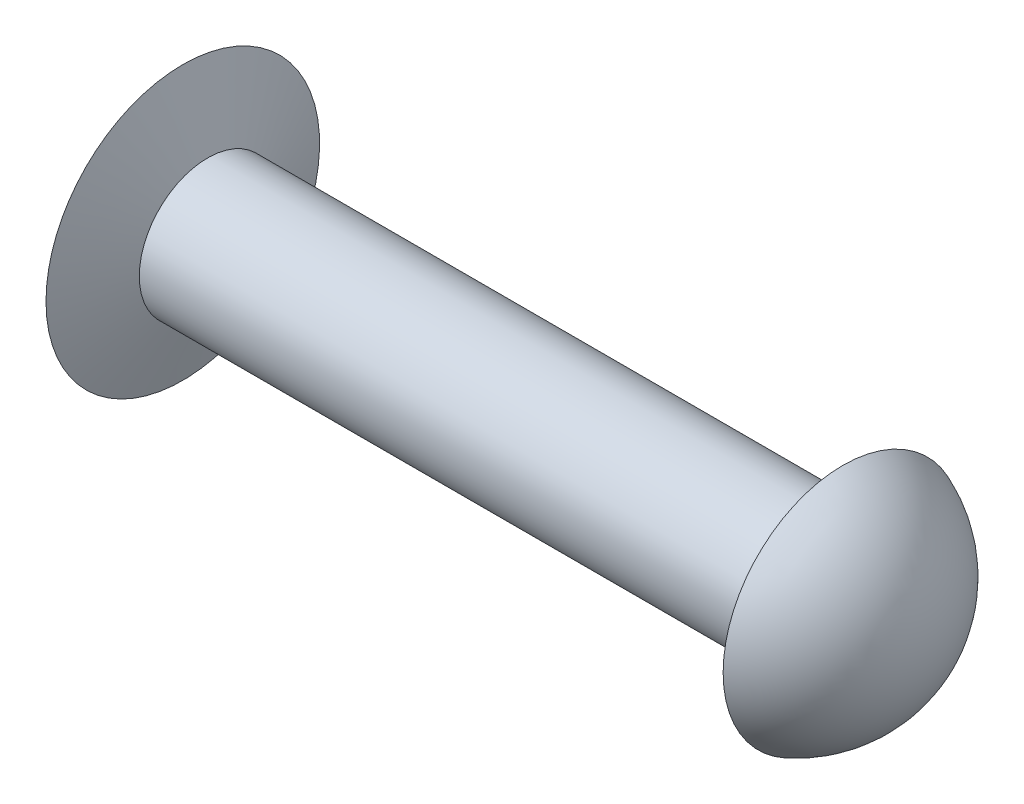
ISO-10303-21;
HEADER;
FILE_DESCRIPTION(('STEP AP214'),'2;1');
FILE_NAME('part.step','',(''),(''),'','','');
FILE_SCHEMA(('AUTOMOTIVE_DESIGN { 1 0 10303 214 1 1 1 1 }'));
ENDSEC;
DATA;
#1=APPLICATION_CONTEXT('core data for automotive mechanical design processes');
#2=APPLICATION_PROTOCOL_DEFINITION('international standard','automotive_design',2000,#1);
#3=PRODUCT_CONTEXT('',#1,'mechanical');
#4=PRODUCT('Part','Part','',(#3));
#5=PRODUCT_RELATED_PRODUCT_CATEGORY('part','',(#4));
#6=PRODUCT_DEFINITION_FORMATION('','',#4);
#7=PRODUCT_DEFINITION_CONTEXT('part definition',#1,'design');
#8=PRODUCT_DEFINITION('design','',#6,#7);
#9=PRODUCT_DEFINITION_SHAPE('','',#8);
#10=(LENGTH_UNIT() NAMED_UNIT(*) SI_UNIT(.MILLI.,.METRE.));
#11=(NAMED_UNIT(*) PLANE_ANGLE_UNIT() SI_UNIT($,.RADIAN.));
#12=(NAMED_UNIT(*) SI_UNIT($,.STERADIAN.) SOLID_ANGLE_UNIT());
#13=UNCERTAINTY_MEASURE_WITH_UNIT(LENGTH_MEASURE(1.E-05),#10,'distance_accuracy_value','');
#14=(GEOMETRIC_REPRESENTATION_CONTEXT(3) GLOBAL_UNCERTAINTY_ASSIGNED_CONTEXT((#13)) GLOBAL_UNIT_ASSIGNED_CONTEXT((#10,
#11,#12)) REPRESENTATION_CONTEXT('',''));
#15=CARTESIAN_POINT('',(0.,0.,0.));
#16=DIRECTION('',(0.,0.,1.));
#17=DIRECTION('',(1.,0.,0.));
#18=AXIS2_PLACEMENT_3D('',#15,#16,#17);
#19=CARTESIAN_POINT('',(-39.,0.,0.));
#20=DIRECTION('',(-1.,0.,0.));
#21=DIRECTION('',(0.,0.,1.));
#22=AXIS2_PLACEMENT_3D('',#19,#20,#21);
#23=CYLINDRICAL_SURFACE('',#22,3.);
#24=CARTESIAN_POINT('',(-27.858858534395,0.,0.));
#25=DIRECTION('',(-1.,0.,0.));
#26=DIRECTION('',(0.,0.,1.));
#27=AXIS2_PLACEMENT_3D('',#24,#25,#26);
#28=CIRCLE('',#27,3.);
#29=CARTESIAN_POINT('',(-27.858858534395,0.,3.));
#30=VERTEX_POINT('',#29);
#31=EDGE_CURVE('E10',#30,#30,#28,.T.);
#32=ORIENTED_EDGE('',*,*,#31,.F.);
#33=EDGE_LOOP('',(#32));
#34=FACE_BOUND('',#33,.T.);
#35=CARTESIAN_POINT('',(0.,0.,0.));
#36=DIRECTION('',(1.,0.,0.));
#37=DIRECTION('',(0.,0.,-1.));
#38=AXIS2_PLACEMENT_3D('',#35,#36,#37);
#39=CIRCLE('',#38,3.);
#40=CARTESIAN_POINT('',(0.,0.,-3.));
#41=VERTEX_POINT('',#40);
#42=EDGE_CURVE('E40',#41,#41,#39,.T.);
#43=ORIENTED_EDGE('',*,*,#42,.F.);
#44=EDGE_LOOP('',(#43));
#45=FACE_BOUND('',#44,.T.);
#46=ADVANCED_FACE('F30',(#34,#45),#23,.T.);
#47=CARTESIAN_POINT('',(-27.858858534395,0.,0.));
#48=DIRECTION('',(-1.,0.,0.));
#49=DIRECTION('',(0.,0.,1.));
#50=AXIS2_PLACEMENT_3D('',#47,#48,#49);
#51=CONICAL_SURFACE('',#50,3.,1.22173047639603);
#52=CARTESIAN_POINT('',(-28.9507692371936,0.,0.));
#53=DIRECTION('',(-1.,0.,0.));
#54=DIRECTION('',(0.,0.,1.));
#55=AXIS2_PLACEMENT_3D('',#52,#53,#54);
#56=CIRCLE('',#55,6.);
#57=CARTESIAN_POINT('',(-28.9507692371936,0.,6.));
#58=VERTEX_POINT('',#57);
#59=EDGE_CURVE('E36',#58,#58,#56,.T.);
#60=ORIENTED_EDGE('',*,*,#59,.F.);
#61=EDGE_LOOP('',(#60));
#62=FACE_BOUND('',#61,.T.);
#63=ORIENTED_EDGE('',*,*,#31,.T.);
#64=EDGE_LOOP('',(#63));
#65=FACE_BOUND('',#64,.T.);
#66=ADVANCED_FACE('F62',(#62,#65),#51,.T.);
#67=CARTESIAN_POINT('',(-20.9507692371936,0.,0.));
#68=DIRECTION('',(-1.,0.,0.));
#69=DIRECTION('',(0.,1.,0.));
#70=AXIS2_PLACEMENT_3D('',#67,#68,#69);
#71=SPHERICAL_SURFACE('',#70,10.);
#72=ORIENTED_EDGE('',*,*,#59,.T.);
#73=EDGE_LOOP('',(#72));
#74=FACE_BOUND('',#73,.T.);
#75=ADVANCED_FACE('F58',(#74),#71,.T.);
#76=CARTESIAN_POINT('',(0.,0.,0.));
#77=DIRECTION('',(1.,0.,0.));
#78=DIRECTION('',(0.,0.,-1.));
#79=AXIS2_PLACEMENT_3D('',#76,#77,#78);
#80=PLANE('',#79);
#81=ORIENTED_EDGE('',*,*,#42,.T.);
#82=EDGE_LOOP('',(#81));
#83=FACE_BOUND('',#82,.T.);
#84=CARTESIAN_POINT('',(0.,0.,0.));
#85=DIRECTION('',(-1.,0.,0.));
#86=DIRECTION('',(0.,0.,1.));
#87=AXIS2_PLACEMENT_3D('',#84,#85,#86);
#88=CIRCLE('',#87,5.25);
#89=CARTESIAN_POINT('',(0.,0.,5.25));
#90=VERTEX_POINT('',#89);
#91=EDGE_CURVE('E44',#90,#90,#88,.T.);
#92=ORIENTED_EDGE('',*,*,#91,.T.);
#93=EDGE_LOOP('',(#92));
#94=FACE_BOUND('',#93,.T.);
#95=ADVANCED_FACE('F50',(#83,#94),#80,.F.);
#96=CARTESIAN_POINT('',(-2.028125,0.,0.));
#97=DIRECTION('',(-1.,0.,0.));
#98=DIRECTION('',(0.,1.,0.));
#99=AXIS2_PLACEMENT_3D('',#96,#97,#98);
#100=SPHERICAL_SURFACE('',#99,5.628125);
#101=ORIENTED_EDGE('',*,*,#91,.F.);
#102=EDGE_LOOP('',(#101));
#103=FACE_BOUND('',#102,.T.);
#104=ADVANCED_FACE('F52',(#103),#100,.T.);
#105=CLOSED_SHELL('',(#46,#66,#75,#95,#104));
#106=MANIFOLD_SOLID_BREP('B2',#105);
#107=ADVANCED_BREP_SHAPE_REPRESENTATION('',(#18,#106),#14);
#108=SHAPE_DEFINITION_REPRESENTATION(#9,#107);
ENDSEC;
END-ISO-10303-21;
